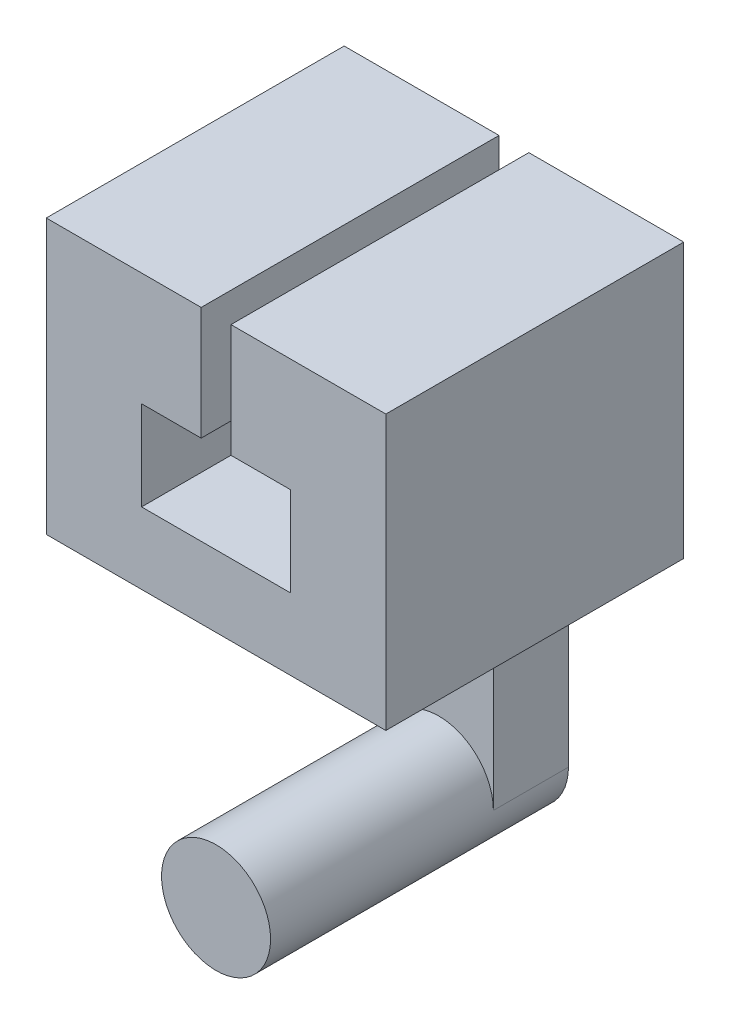
ISO-10303-21;
HEADER;
FILE_DESCRIPTION(('STEP AP214'),'2;1');
FILE_NAME('part.step','',(''),(''),'','','');
FILE_SCHEMA(('AUTOMOTIVE_DESIGN { 1 0 10303 214 1 1 1 1 }'));
ENDSEC;
DATA;
#1=APPLICATION_CONTEXT('core data for automotive mechanical design processes');
#2=APPLICATION_PROTOCOL_DEFINITION('international standard','automotive_design',2000,#1);
#3=PRODUCT_CONTEXT('',#1,'mechanical');
#4=PRODUCT('Part','Part','',(#3));
#5=PRODUCT_RELATED_PRODUCT_CATEGORY('part','',(#4));
#6=PRODUCT_DEFINITION_FORMATION('','',#4);
#7=PRODUCT_DEFINITION_CONTEXT('part definition',#1,'design');
#8=PRODUCT_DEFINITION('design','',#6,#7);
#9=PRODUCT_DEFINITION_SHAPE('','',#8);
#10=(LENGTH_UNIT() NAMED_UNIT(*) SI_UNIT(.MILLI.,.METRE.));
#11=(NAMED_UNIT(*) PLANE_ANGLE_UNIT() SI_UNIT($,.RADIAN.));
#12=(NAMED_UNIT(*) SI_UNIT($,.STERADIAN.) SOLID_ANGLE_UNIT());
#13=UNCERTAINTY_MEASURE_WITH_UNIT(LENGTH_MEASURE(1.E-05),#10,'distance_accuracy_value','');
#14=(GEOMETRIC_REPRESENTATION_CONTEXT(3) GLOBAL_UNCERTAINTY_ASSIGNED_CONTEXT((#13)) GLOBAL_UNIT_ASSIGNED_CONTEXT((#10,
#11,#12)) REPRESENTATION_CONTEXT('',''));
#15=CARTESIAN_POINT('',(0.,0.,0.));
#16=DIRECTION('',(0.,0.,1.));
#17=DIRECTION('',(1.,0.,0.));
#18=AXIS2_PLACEMENT_3D('',#15,#16,#17);
#19=CARTESIAN_POINT('',(31.75,132.08,-127.));
#20=DIRECTION('',(1.,0.,0.));
#21=DIRECTION('',(0.,0.,-1.));
#22=AXIS2_PLACEMENT_3D('',#19,#20,#21);
#23=PLANE('',#22);
#24=DIRECTION('',(0.,0.,1.));
#25=VECTOR('',#24,1.);
#26=CARTESIAN_POINT('',(31.75,170.18,-127.));
#27=LINE('',#26,#25);
#28=CARTESIAN_POINT('',(31.75,170.18,-127.));
#29=VERTEX_POINT('',#28);
#30=CARTESIAN_POINT('',(31.75,170.18,0.));
#31=VERTEX_POINT('',#30);
#32=EDGE_CURVE('E275',#29,#31,#27,.T.);
#33=ORIENTED_EDGE('',*,*,#32,.F.);
#34=DIRECTION('',(0.,1.,0.));
#35=VECTOR('',#34,1.);
#36=CARTESIAN_POINT('',(31.75,132.08,-127.));
#37=LINE('',#36,#35);
#38=CARTESIAN_POINT('',(31.75,132.08,-127.));
#39=VERTEX_POINT('',#38);
#40=EDGE_CURVE('E373',#39,#29,#37,.T.);
#41=ORIENTED_EDGE('',*,*,#40,.F.);
#42=DIRECTION('',(0.,0.,1.));
#43=VECTOR('',#42,1.);
#44=CARTESIAN_POINT('',(31.75,132.08,-127.));
#45=LINE('',#44,#43);
#46=CARTESIAN_POINT('',(31.75,132.08,0.));
#47=VERTEX_POINT('',#46);
#48=EDGE_CURVE('E278',#39,#47,#45,.T.);
#49=ORIENTED_EDGE('',*,*,#48,.T.);
#50=DIRECTION('',(0.,1.,0.));
#51=VECTOR('',#50,1.);
#52=CARTESIAN_POINT('',(31.75,132.08,0.));
#53=LINE('',#52,#51);
#54=EDGE_CURVE('E367',#47,#31,#53,.T.);
#55=ORIENTED_EDGE('',*,*,#54,.T.);
#56=EDGE_LOOP('',(#33,#41,#49,#55));
#57=FACE_BOUND('',#56,.T.);
#58=ADVANCED_FACE('F251',(#57),#23,.F.);
#59=CARTESIAN_POINT('',(31.75,132.08,0.));
#60=DIRECTION('',(0.,-1.,0.));
#61=DIRECTION('',(0.,0.,-1.));
#62=AXIS2_PLACEMENT_3D('',#59,#60,#61);
#63=PLANE('',#62);
#64=ORIENTED_EDGE('',*,*,#48,.F.);
#65=DIRECTION('',(-1.,0.,0.));
#66=VECTOR('',#65,1.);
#67=CARTESIAN_POINT('',(31.75,132.08,-127.));
#68=LINE('',#67,#66);
#69=CARTESIAN_POINT('',(-31.75,132.08,-127.));
#70=VERTEX_POINT('',#69);
#71=EDGE_CURVE('E492',#39,#70,#68,.T.);
#72=ORIENTED_EDGE('',*,*,#71,.T.);
#73=DIRECTION('',(0.,0.,1.));
#74=VECTOR('',#73,1.);
#75=CARTESIAN_POINT('',(-31.75,132.08,-127.));
#76=LINE('',#75,#74);
#77=CARTESIAN_POINT('',(-31.75,132.08,0.));
#78=VERTEX_POINT('',#77);
#79=EDGE_CURVE('E472',#70,#78,#76,.T.);
#80=ORIENTED_EDGE('',*,*,#79,.T.);
#81=DIRECTION('',(-1.,0.,0.));
#82=VECTOR('',#81,1.);
#83=CARTESIAN_POINT('',(31.75,132.08,0.));
#84=LINE('',#83,#82);
#85=EDGE_CURVE('E494',#47,#78,#84,.T.);
#86=ORIENTED_EDGE('',*,*,#85,.F.);
#87=EDGE_LOOP('',(#64,#72,#80,#86));
#88=FACE_BOUND('',#87,.T.);
#89=ADVANCED_FACE('F619',(#88),#63,.F.);
#90=CARTESIAN_POINT('',(-31.75,132.08,-127.));
#91=DIRECTION('',(1.,0.,0.));
#92=DIRECTION('',(0.,0.,-1.));
#93=AXIS2_PLACEMENT_3D('',#90,#91,#92);
#94=PLANE('',#93);
#95=DIRECTION('',(0.,1.,0.));
#96=VECTOR('',#95,1.);
#97=CARTESIAN_POINT('',(-31.75,132.08,-127.));
#98=LINE('',#97,#96);
#99=CARTESIAN_POINT('',(-31.75,170.18,-127.));
#100=VERTEX_POINT('',#99);
#101=EDGE_CURVE('E470',#70,#100,#98,.T.);
#102=ORIENTED_EDGE('',*,*,#101,.T.);
#103=DIRECTION('',(0.,0.,1.));
#104=VECTOR('',#103,1.);
#105=CARTESIAN_POINT('',(-31.75,170.18,-127.));
#106=LINE('',#105,#104);
#107=CARTESIAN_POINT('',(-31.75,170.18,0.));
#108=VERTEX_POINT('',#107);
#109=EDGE_CURVE('E440',#100,#108,#106,.T.);
#110=ORIENTED_EDGE('',*,*,#109,.T.);
#111=DIRECTION('',(0.,1.,0.));
#112=VECTOR('',#111,1.);
#113=CARTESIAN_POINT('',(-31.75,132.08,0.));
#114=LINE('',#113,#112);
#115=EDGE_CURVE('E467',#78,#108,#114,.T.);
#116=ORIENTED_EDGE('',*,*,#115,.F.);
#117=ORIENTED_EDGE('',*,*,#79,.F.);
#118=EDGE_LOOP('',(#102,#110,#116,#117));
#119=FACE_BOUND('',#118,.T.);
#120=ADVANCED_FACE('F622',(#119),#94,.T.);
#121=CARTESIAN_POINT('',(23.241,0.,-94.996));
#122=DIRECTION('',(1.,0.,0.));
#123=DIRECTION('',(0.,0.,-1.));
#124=AXIS2_PLACEMENT_3D('',#121,#122,#123);
#125=PLANE('',#124);
#126=DIRECTION('',(0.,-1.,0.));
#127=VECTOR('',#126,1.);
#128=CARTESIAN_POINT('',(23.241,0.,-127.));
#129=LINE('',#128,#127);
#130=CARTESIAN_POINT('',(23.241,101.6,-127.));
#131=VERTEX_POINT('',#130);
#132=CARTESIAN_POINT('',(23.241,0.,-127.));
#133=VERTEX_POINT('',#132);
#134=EDGE_CURVE('E498',#131,#133,#129,.T.);
#135=ORIENTED_EDGE('',*,*,#134,.F.);
#136=DIRECTION('',(0.,0.,-1.));
#137=VECTOR('',#136,1.);
#138=CARTESIAN_POINT('',(23.241,101.6,-94.996));
#139=LINE('',#138,#137);
#140=CARTESIAN_POINT('',(23.241,101.6,-94.996));
#141=VERTEX_POINT('',#140);
#142=EDGE_CURVE('E13',#141,#131,#139,.T.);
#143=ORIENTED_EDGE('',*,*,#142,.F.);
#144=DIRECTION('',(0.,-1.,0.));
#145=VECTOR('',#144,1.);
#146=CARTESIAN_POINT('',(23.241,0.,-94.996));
#147=LINE('',#146,#145);
#148=CARTESIAN_POINT('',(23.241,0.,-94.996));
#149=VERTEX_POINT('',#148);
#150=EDGE_CURVE('E504',#141,#149,#147,.T.);
#151=ORIENTED_EDGE('',*,*,#150,.T.);
#152=DIRECTION('',(0.,0.,-1.));
#153=VECTOR('',#152,1.);
#154=CARTESIAN_POINT('',(23.241,0.,-94.996));
#155=LINE('',#154,#153);
#156=EDGE_CURVE('E259',#149,#133,#155,.T.);
#157=ORIENTED_EDGE('',*,*,#156,.T.);
#158=EDGE_LOOP('',(#135,#143,#151,#157));
#159=FACE_BOUND('',#158,.T.);
#160=ADVANCED_FACE('F257',(#159),#125,.T.);
#161=CARTESIAN_POINT('',(-23.241,0.,-94.996));
#162=DIRECTION('',(-1.,0.,0.));
#163=DIRECTION('',(0.,0.,1.));
#164=AXIS2_PLACEMENT_3D('',#161,#162,#163);
#165=PLANE('',#164);
#166=DIRECTION('',(0.,1.,0.));
#167=VECTOR('',#166,1.);
#168=CARTESIAN_POINT('',(-23.241,0.,-127.));
#169=LINE('',#168,#167);
#170=CARTESIAN_POINT('',(-23.241,0.,-127.));
#171=VERTEX_POINT('',#170);
#172=CARTESIAN_POINT('',(-23.241,101.6,-127.));
#173=VERTEX_POINT('',#172);
#174=EDGE_CURVE('E509',#171,#173,#169,.T.);
#175=ORIENTED_EDGE('',*,*,#174,.F.);
#176=DIRECTION('',(0.,0.,-1.));
#177=VECTOR('',#176,1.);
#178=CARTESIAN_POINT('',(-23.241,0.,-94.996));
#179=LINE('',#178,#177);
#180=CARTESIAN_POINT('',(-23.241,0.,-94.996));
#181=VERTEX_POINT('',#180);
#182=EDGE_CURVE('E535',#181,#171,#179,.T.);
#183=ORIENTED_EDGE('',*,*,#182,.F.);
#184=DIRECTION('',(0.,1.,0.));
#185=VECTOR('',#184,1.);
#186=CARTESIAN_POINT('',(-23.241,0.,-94.996));
#187=LINE('',#186,#185);
#188=CARTESIAN_POINT('',(-23.241,101.6,-94.996));
#189=VERTEX_POINT('',#188);
#190=EDGE_CURVE('E511',#181,#189,#187,.T.);
#191=ORIENTED_EDGE('',*,*,#190,.T.);
#192=DIRECTION('',(0.,0.,-1.));
#193=VECTOR('',#192,1.);
#194=CARTESIAN_POINT('',(-23.241,101.6,-94.996));
#195=LINE('',#194,#193);
#196=EDGE_CURVE('E262',#189,#173,#195,.T.);
#197=ORIENTED_EDGE('',*,*,#196,.T.);
#198=EDGE_LOOP('',(#175,#183,#191,#197));
#199=FACE_BOUND('',#198,.T.);
#200=ADVANCED_FACE('F606',(#199),#165,.T.);
#201=CARTESIAN_POINT('',(23.241,0.,-94.996));
#202=DIRECTION('',(0.,-1.,0.));
#203=DIRECTION('',(0.,0.,-1.));
#204=AXIS2_PLACEMENT_3D('',#201,#202,#203);
#205=PLANE('',#204);
#206=DIRECTION('',(-1.,0.,0.));
#207=VECTOR('',#206,1.);
#208=CARTESIAN_POINT('',(23.241,0.,-127.));
#209=LINE('',#208,#207);
#210=EDGE_CURVE('E522',#133,#171,#209,.T.);
#211=ORIENTED_EDGE('',*,*,#210,.F.);
#212=ORIENTED_EDGE('',*,*,#156,.F.);
#213=DIRECTION('',(-1.,0.,0.));
#214=VECTOR('',#213,1.);
#215=CARTESIAN_POINT('',(23.241,0.,-94.996));
#216=LINE('',#215,#214);
#217=EDGE_CURVE('E508',#149,#181,#216,.T.);
#218=ORIENTED_EDGE('',*,*,#217,.T.);
#219=ORIENTED_EDGE('',*,*,#182,.T.);
#220=EDGE_LOOP('',(#211,#212,#218,#219));
#221=FACE_BOUND('',#220,.T.);
#222=ADVANCED_FACE('F543',(#221),#205,.T.);
#223=CARTESIAN_POINT('',(0.,0.,-94.996));
#224=DIRECTION('',(0.,0.,1.));
#225=DIRECTION('',(1.,0.,0.));
#226=AXIS2_PLACEMENT_3D('',#223,#224,#225);
#227=PLANE('',#226);
#228=ORIENTED_EDGE('',*,*,#150,.F.);
#229=DIRECTION('',(1.,0.,0.));
#230=VECTOR('',#229,1.);
#231=CARTESIAN_POINT('',(23.241,101.6,-94.996));
#232=LINE('',#231,#230);
#233=EDGE_CURVE('E520',#189,#141,#232,.T.);
#234=ORIENTED_EDGE('',*,*,#233,.F.);
#235=ORIENTED_EDGE('',*,*,#190,.F.);
#236=ORIENTED_EDGE('',*,*,#217,.F.);
#237=EDGE_LOOP('',(#228,#234,#235,#236));
#238=FACE_BOUND('',#237,.T.);
#239=ADVANCED_FACE('F607',(#238),#227,.T.);
#240=CARTESIAN_POINT('',(0.,0.,-127.));
#241=DIRECTION('',(0.,0.,1.));
#242=DIRECTION('',(1.,0.,0.));
#243=AXIS2_PLACEMENT_3D('',#240,#241,#242);
#244=PLANE('',#243);
#245=ORIENTED_EDGE('',*,*,#134,.T.);
#246=ORIENTED_EDGE('',*,*,#210,.T.);
#247=ORIENTED_EDGE('',*,*,#174,.T.);
#248=DIRECTION('',(1.,0.,0.));
#249=VECTOR('',#248,1.);
#250=CARTESIAN_POINT('',(23.241,101.6,-127.));
#251=LINE('',#250,#249);
#252=CARTESIAN_POINT('',(-72.39,101.6,-127.));
#253=VERTEX_POINT('',#252);
#254=EDGE_CURVE('E497',#253,#173,#251,.T.);
#255=ORIENTED_EDGE('',*,*,#254,.F.);
#256=DIRECTION('',(0.,-1.,0.));
#257=VECTOR('',#256,1.);
#258=CARTESIAN_POINT('',(-72.39,132.08,-127.));
#259=LINE('',#258,#257);
#260=CARTESIAN_POINT('',(-72.39,218.44,-127.));
#261=VERTEX_POINT('',#260);
#262=EDGE_CURVE('E484',#261,#253,#259,.T.);
#263=ORIENTED_EDGE('',*,*,#262,.F.);
#264=DIRECTION('',(-1.,0.,0.));
#265=VECTOR('',#264,1.);
#266=CARTESIAN_POINT('',(-31.75,218.44,-127.));
#267=LINE('',#266,#265);
#268=CARTESIAN_POINT('',(-6.35,218.44,-127.));
#269=VERTEX_POINT('',#268);
#270=EDGE_CURVE('E453',#269,#261,#267,.T.);
#271=ORIENTED_EDGE('',*,*,#270,.F.);
#272=DIRECTION('',(0.,1.,0.));
#273=VECTOR('',#272,1.);
#274=CARTESIAN_POINT('',(-6.35,170.18,-127.));
#275=LINE('',#274,#273);
#276=CARTESIAN_POINT('',(-6.35,170.18,-127.));
#277=VERTEX_POINT('',#276);
#278=EDGE_CURVE('E435',#277,#269,#275,.T.);
#279=ORIENTED_EDGE('',*,*,#278,.F.);
#280=DIRECTION('',(1.,0.,0.));
#281=VECTOR('',#280,1.);
#282=CARTESIAN_POINT('',(-31.75,170.18,-127.));
#283=LINE('',#282,#281);
#284=EDGE_CURVE('E426',#100,#277,#283,.T.);
#285=ORIENTED_EDGE('',*,*,#284,.F.);
#286=ORIENTED_EDGE('',*,*,#101,.F.);
#287=ORIENTED_EDGE('',*,*,#71,.F.);
#288=ORIENTED_EDGE('',*,*,#40,.T.);
#289=DIRECTION('',(1.,0.,0.));
#290=VECTOR('',#289,1.);
#291=CARTESIAN_POINT('',(31.75,170.18,-127.));
#292=LINE('',#291,#290);
#293=CARTESIAN_POINT('',(6.35,170.18,-127.));
#294=VERTEX_POINT('',#293);
#295=EDGE_CURVE('E385',#294,#29,#292,.T.);
#296=ORIENTED_EDGE('',*,*,#295,.F.);
#297=DIRECTION('',(0.,-1.,0.));
#298=VECTOR('',#297,1.);
#299=CARTESIAN_POINT('',(6.35,170.18,-127.));
#300=LINE('',#299,#298);
#301=CARTESIAN_POINT('',(6.35,218.44,-127.));
#302=VERTEX_POINT('',#301);
#303=EDGE_CURVE('E391',#302,#294,#300,.T.);
#304=ORIENTED_EDGE('',*,*,#303,.F.);
#305=DIRECTION('',(-1.,0.,0.));
#306=VECTOR('',#305,1.);
#307=CARTESIAN_POINT('',(31.75,218.44,-127.));
#308=LINE('',#307,#306);
#309=CARTESIAN_POINT('',(72.39,218.44,-127.));
#310=VERTEX_POINT('',#309);
#311=EDGE_CURVE('E409',#310,#302,#308,.T.);
#312=ORIENTED_EDGE('',*,*,#311,.F.);
#313=DIRECTION('',(0.,1.,0.));
#314=VECTOR('',#313,1.);
#315=CARTESIAN_POINT('',(72.39,101.6,-127.));
#316=LINE('',#315,#314);
#317=CARTESIAN_POINT('',(72.39,101.6,-127.));
#318=VERTEX_POINT('',#317);
#319=EDGE_CURVE('E423',#318,#310,#316,.T.);
#320=ORIENTED_EDGE('',*,*,#319,.F.);
#321=EDGE_CURVE('E487',#131,#318,#251,.T.);
#322=ORIENTED_EDGE('',*,*,#321,.F.);
#323=EDGE_LOOP('',(#245,#246,#247,#255,#263,#271,#279,#285,#286,#287,#288,#296,#304,#312,#320,#322));
#324=FACE_BOUND('',#323,.T.);
#325=ADVANCED_FACE('F547',(#324),#244,.F.);
#326=CARTESIAN_POINT('',(23.241,101.6,0.));
#327=DIRECTION('',(0.,1.,0.));
#328=DIRECTION('',(0.,0.,1.));
#329=AXIS2_PLACEMENT_3D('',#326,#327,#328);
#330=PLANE('',#329);
#331=ORIENTED_EDGE('',*,*,#196,.F.);
#332=ORIENTED_EDGE('',*,*,#233,.T.);
#333=ORIENTED_EDGE('',*,*,#142,.T.);
#334=ORIENTED_EDGE('',*,*,#321,.T.);
#335=DIRECTION('',(0.,0.,1.));
#336=VECTOR('',#335,1.);
#337=CARTESIAN_POINT('',(72.39,101.6,-127.));
#338=LINE('',#337,#336);
#339=CARTESIAN_POINT('',(72.39,101.6,0.));
#340=VERTEX_POINT('',#339);
#341=EDGE_CURVE('E419',#318,#340,#338,.T.);
#342=ORIENTED_EDGE('',*,*,#341,.T.);
#343=DIRECTION('',(1.,0.,0.));
#344=VECTOR('',#343,1.);
#345=CARTESIAN_POINT('',(-31.75,101.6,0.));
#346=LINE('',#345,#344);
#347=CARTESIAN_POINT('',(-72.39,101.6,0.));
#348=VERTEX_POINT('',#347);
#349=EDGE_CURVE('E493',#348,#340,#346,.T.);
#350=ORIENTED_EDGE('',*,*,#349,.F.);
#351=DIRECTION('',(0.,0.,1.));
#352=VECTOR('',#351,1.);
#353=CARTESIAN_POINT('',(-72.39,101.6,-127.));
#354=LINE('',#353,#352);
#355=EDGE_CURVE('E478',#253,#348,#354,.T.);
#356=ORIENTED_EDGE('',*,*,#355,.F.);
#357=ORIENTED_EDGE('',*,*,#254,.T.);
#358=EDGE_LOOP('',(#331,#332,#333,#334,#342,#350,#356,#357));
#359=FACE_BOUND('',#358,.T.);
#360=ADVANCED_FACE('F592',(#359),#330,.F.);
#361=CARTESIAN_POINT('',(0.,0.,0.));
#362=DIRECTION('',(0.,0.,1.));
#363=DIRECTION('',(1.,0.,0.));
#364=AXIS2_PLACEMENT_3D('',#361,#362,#363);
#365=PLANE('',#364);
#366=ORIENTED_EDGE('',*,*,#349,.T.);
#367=DIRECTION('',(0.,1.,0.));
#368=VECTOR('',#367,1.);
#369=CARTESIAN_POINT('',(72.39,101.6,0.));
#370=LINE('',#369,#368);
#371=CARTESIAN_POINT('',(72.39,218.44,0.));
#372=VERTEX_POINT('',#371);
#373=EDGE_CURVE('E422',#340,#372,#370,.T.);
#374=ORIENTED_EDGE('',*,*,#373,.T.);
#375=DIRECTION('',(-1.,0.,0.));
#376=VECTOR('',#375,1.);
#377=CARTESIAN_POINT('',(31.75,218.44,0.));
#378=LINE('',#377,#376);
#379=CARTESIAN_POINT('',(6.35,218.44,0.));
#380=VERTEX_POINT('',#379);
#381=EDGE_CURVE('E372',#372,#380,#378,.T.);
#382=ORIENTED_EDGE('',*,*,#381,.T.);
#383=DIRECTION('',(0.,-1.,0.));
#384=VECTOR('',#383,1.);
#385=CARTESIAN_POINT('',(6.35,170.18,0.));
#386=LINE('',#385,#384);
#387=CARTESIAN_POINT('',(6.35,170.18,0.));
#388=VERTEX_POINT('',#387);
#389=EDGE_CURVE('E386',#380,#388,#386,.T.);
#390=ORIENTED_EDGE('',*,*,#389,.T.);
#391=DIRECTION('',(1.,0.,0.));
#392=VECTOR('',#391,1.);
#393=CARTESIAN_POINT('',(31.75,170.18,0.));
#394=LINE('',#393,#392);
#395=EDGE_CURVE('E379',#388,#31,#394,.T.);
#396=ORIENTED_EDGE('',*,*,#395,.T.);
#397=ORIENTED_EDGE('',*,*,#54,.F.);
#398=ORIENTED_EDGE('',*,*,#85,.T.);
#399=ORIENTED_EDGE('',*,*,#115,.T.);
#400=DIRECTION('',(1.,0.,0.));
#401=VECTOR('',#400,1.);
#402=CARTESIAN_POINT('',(-31.75,170.18,0.));
#403=LINE('',#402,#401);
#404=CARTESIAN_POINT('',(-6.35,170.18,0.));
#405=VERTEX_POINT('',#404);
#406=EDGE_CURVE('E424',#108,#405,#403,.T.);
#407=ORIENTED_EDGE('',*,*,#406,.T.);
#408=DIRECTION('',(0.,1.,0.));
#409=VECTOR('',#408,1.);
#410=CARTESIAN_POINT('',(-6.35,170.18,0.));
#411=LINE('',#410,#409);
#412=CARTESIAN_POINT('',(-6.35,218.44,0.));
#413=VERTEX_POINT('',#412);
#414=EDGE_CURVE('E433',#405,#413,#411,.T.);
#415=ORIENTED_EDGE('',*,*,#414,.T.);
#416=DIRECTION('',(-1.,0.,0.));
#417=VECTOR('',#416,1.);
#418=CARTESIAN_POINT('',(-31.75,218.44,0.));
#419=LINE('',#418,#417);
#420=CARTESIAN_POINT('',(-72.39,218.44,0.));
#421=VERTEX_POINT('',#420);
#422=EDGE_CURVE('E449',#413,#421,#419,.T.);
#423=ORIENTED_EDGE('',*,*,#422,.T.);
#424=DIRECTION('',(0.,-1.,0.));
#425=VECTOR('',#424,1.);
#426=CARTESIAN_POINT('',(-72.39,132.08,0.));
#427=LINE('',#426,#425);
#428=EDGE_CURVE('E485',#421,#348,#427,.T.);
#429=ORIENTED_EDGE('',*,*,#428,.T.);
#430=EDGE_LOOP('',(#366,#374,#382,#390,#396,#397,#398,#399,#407,#415,#423,#429));
#431=FACE_BOUND('',#430,.T.);
#432=ADVANCED_FACE('F390',(#431),#365,.T.);
#433=CARTESIAN_POINT('',(-72.39,132.08,-127.));
#434=DIRECTION('',(-1.,0.,0.));
#435=DIRECTION('',(0.,0.,1.));
#436=AXIS2_PLACEMENT_3D('',#433,#434,#435);
#437=PLANE('',#436);
#438=ORIENTED_EDGE('',*,*,#428,.F.);
#439=DIRECTION('',(0.,0.,1.));
#440=VECTOR('',#439,1.);
#441=CARTESIAN_POINT('',(-72.39,218.44,-127.));
#442=LINE('',#441,#440);
#443=EDGE_CURVE('E457',#261,#421,#442,.T.);
#444=ORIENTED_EDGE('',*,*,#443,.F.);
#445=ORIENTED_EDGE('',*,*,#262,.T.);
#446=ORIENTED_EDGE('',*,*,#355,.T.);
#447=EDGE_LOOP('',(#438,#444,#445,#446));
#448=FACE_BOUND('',#447,.T.);
#449=ADVANCED_FACE('F598',(#448),#437,.T.);
#450=CARTESIAN_POINT('',(-31.75,218.44,-127.));
#451=DIRECTION('',(0.,1.,0.));
#452=DIRECTION('',(0.,0.,1.));
#453=AXIS2_PLACEMENT_3D('',#450,#451,#452);
#454=PLANE('',#453);
#455=ORIENTED_EDGE('',*,*,#422,.F.);
#456=DIRECTION('',(0.,0.,1.));
#457=VECTOR('',#456,1.);
#458=CARTESIAN_POINT('',(-6.35,218.44,-127.));
#459=LINE('',#458,#457);
#460=EDGE_CURVE('E443',#269,#413,#459,.T.);
#461=ORIENTED_EDGE('',*,*,#460,.F.);
#462=ORIENTED_EDGE('',*,*,#270,.T.);
#463=ORIENTED_EDGE('',*,*,#443,.T.);
#464=EDGE_LOOP('',(#455,#461,#462,#463));
#465=FACE_BOUND('',#464,.T.);
#466=ADVANCED_FACE('F640',(#465),#454,.T.);
#467=CARTESIAN_POINT('',(-6.35,170.18,-127.));
#468=DIRECTION('',(1.,0.,0.));
#469=DIRECTION('',(0.,0.,-1.));
#470=AXIS2_PLACEMENT_3D('',#467,#468,#469);
#471=PLANE('',#470);
#472=ORIENTED_EDGE('',*,*,#414,.F.);
#473=DIRECTION('',(0.,0.,1.));
#474=VECTOR('',#473,1.);
#475=CARTESIAN_POINT('',(-6.35,170.18,-127.));
#476=LINE('',#475,#474);
#477=EDGE_CURVE('E446',#277,#405,#476,.T.);
#478=ORIENTED_EDGE('',*,*,#477,.F.);
#479=ORIENTED_EDGE('',*,*,#278,.T.);
#480=ORIENTED_EDGE('',*,*,#460,.T.);
#481=EDGE_LOOP('',(#472,#478,#479,#480));
#482=FACE_BOUND('',#481,.T.);
#483=ADVANCED_FACE('F632',(#482),#471,.T.);
#484=CARTESIAN_POINT('',(-31.75,170.18,-127.));
#485=DIRECTION('',(0.,-1.,0.));
#486=DIRECTION('',(0.,0.,-1.));
#487=AXIS2_PLACEMENT_3D('',#484,#485,#486);
#488=PLANE('',#487);
#489=ORIENTED_EDGE('',*,*,#406,.F.);
#490=ORIENTED_EDGE('',*,*,#109,.F.);
#491=ORIENTED_EDGE('',*,*,#284,.T.);
#492=ORIENTED_EDGE('',*,*,#477,.T.);
#493=EDGE_LOOP('',(#489,#490,#491,#492));
#494=FACE_BOUND('',#493,.T.);
#495=ADVANCED_FACE('F633',(#494),#488,.T.);
#496=CARTESIAN_POINT('',(72.39,101.6,-127.));
#497=DIRECTION('',(1.,0.,0.));
#498=DIRECTION('',(0.,0.,-1.));
#499=AXIS2_PLACEMENT_3D('',#496,#497,#498);
#500=PLANE('',#499);
#501=ORIENTED_EDGE('',*,*,#373,.F.);
#502=ORIENTED_EDGE('',*,*,#341,.F.);
#503=ORIENTED_EDGE('',*,*,#319,.T.);
#504=DIRECTION('',(0.,0.,1.));
#505=VECTOR('',#504,1.);
#506=CARTESIAN_POINT('',(72.39,218.44,-127.));
#507=LINE('',#506,#505);
#508=EDGE_CURVE('E397',#310,#372,#507,.T.);
#509=ORIENTED_EDGE('',*,*,#508,.T.);
#510=EDGE_LOOP('',(#501,#502,#503,#509));
#511=FACE_BOUND('',#510,.T.);
#512=ADVANCED_FACE('F591',(#511),#500,.T.);
#513=CARTESIAN_POINT('',(31.75,218.44,-127.));
#514=DIRECTION('',(0.,1.,0.));
#515=DIRECTION('',(0.,0.,1.));
#516=AXIS2_PLACEMENT_3D('',#513,#514,#515);
#517=PLANE('',#516);
#518=ORIENTED_EDGE('',*,*,#381,.F.);
#519=ORIENTED_EDGE('',*,*,#508,.F.);
#520=ORIENTED_EDGE('',*,*,#311,.T.);
#521=DIRECTION('',(0.,0.,1.));
#522=VECTOR('',#521,1.);
#523=CARTESIAN_POINT('',(6.35,218.44,-127.));
#524=LINE('',#523,#522);
#525=EDGE_CURVE('E401',#302,#380,#524,.T.);
#526=ORIENTED_EDGE('',*,*,#525,.T.);
#527=EDGE_LOOP('',(#518,#519,#520,#526));
#528=FACE_BOUND('',#527,.T.);
#529=ADVANCED_FACE('F627',(#528),#517,.T.);
#530=CARTESIAN_POINT('',(31.75,170.18,-127.));
#531=DIRECTION('',(0.,-1.,0.));
#532=DIRECTION('',(1.,0.,0.));
#533=AXIS2_PLACEMENT_3D('',#530,#531,#532);
#534=PLANE('',#533);
#535=ORIENTED_EDGE('',*,*,#395,.F.);
#536=DIRECTION('',(0.,0.,1.));
#537=VECTOR('',#536,1.);
#538=CARTESIAN_POINT('',(6.35,170.18,-127.));
#539=LINE('',#538,#537);
#540=EDGE_CURVE('E381',#294,#388,#539,.T.);
#541=ORIENTED_EDGE('',*,*,#540,.F.);
#542=ORIENTED_EDGE('',*,*,#295,.T.);
#543=ORIENTED_EDGE('',*,*,#32,.T.);
#544=EDGE_LOOP('',(#535,#541,#542,#543));
#545=FACE_BOUND('',#544,.T.);
#546=ADVANCED_FACE('F378',(#545),#534,.T.);
#547=CARTESIAN_POINT('',(6.35,170.18,-127.));
#548=DIRECTION('',(-1.,0.,0.));
#549=DIRECTION('',(0.,0.,1.));
#550=AXIS2_PLACEMENT_3D('',#547,#548,#549);
#551=PLANE('',#550);
#552=ORIENTED_EDGE('',*,*,#389,.F.);
#553=ORIENTED_EDGE('',*,*,#525,.F.);
#554=ORIENTED_EDGE('',*,*,#303,.T.);
#555=ORIENTED_EDGE('',*,*,#540,.T.);
#556=EDGE_LOOP('',(#552,#553,#554,#555));
#557=FACE_BOUND('',#556,.T.);
#558=ADVANCED_FACE('F701',(#557),#551,.T.);
#559=CLOSED_SHELL('',(#58,#89,#120,#160,#200,#222,#239,#325,#360,#432,#449,#466,#483,#495,#512,
#529,#546,#558));
#560=MANIFOLD_SOLID_BREP('B2',#559);
#561=CARTESIAN_POINT('',(0.,0.,-127.));
#562=DIRECTION('',(0.,0.,1.));
#563=DIRECTION('',(1.,0.,0.));
#564=AXIS2_PLACEMENT_3D('',#561,#562,#563);
#565=CYLINDRICAL_SURFACE('',#564,23.241);
#566=CARTESIAN_POINT('',(0.,0.,-127.));
#567=DIRECTION('',(0.,0.,1.));
#568=DIRECTION('',(1.,0.,0.));
#569=AXIS2_PLACEMENT_3D('',#566,#567,#568);
#570=CIRCLE('',#569,23.241);
#571=CARTESIAN_POINT('',(23.241,0.,-127.));
#572=VERTEX_POINT('',#571);
#573=EDGE_CURVE('E254',#572,#572,#570,.T.);
#574=ORIENTED_EDGE('',*,*,#573,.T.);
#575=EDGE_LOOP('',(#574));
#576=FACE_BOUND('',#575,.T.);
#577=CARTESIAN_POINT('',(0.,0.,0.));
#578=DIRECTION('',(0.,0.,1.));
#579=DIRECTION('',(1.,0.,0.));
#580=AXIS2_PLACEMENT_3D('',#577,#578,#579);
#581=CIRCLE('',#580,23.241);
#582=CARTESIAN_POINT('',(23.241,0.,0.));
#583=VERTEX_POINT('',#582);
#584=EDGE_CURVE('E883',#583,#583,#581,.T.);
#585=ORIENTED_EDGE('',*,*,#584,.F.);
#586=EDGE_LOOP('',(#585));
#587=FACE_BOUND('',#586,.T.);
#588=ADVANCED_FACE('F876',(#576,#587),#565,.T.);
#589=CARTESIAN_POINT('',(0.,0.,-127.));
#590=DIRECTION('',(0.,0.,1.));
#591=DIRECTION('',(1.,0.,0.));
#592=AXIS2_PLACEMENT_3D('',#589,#590,#591);
#593=PLANE('',#592);
#594=ORIENTED_EDGE('',*,*,#573,.F.);
#595=EDGE_LOOP('',(#594));
#596=FACE_BOUND('',#595,.T.);
#597=ADVANCED_FACE('F900',(#596),#593,.F.);
#598=CARTESIAN_POINT('',(0.,0.,0.));
#599=DIRECTION('',(0.,0.,1.));
#600=DIRECTION('',(1.,0.,0.));
#601=AXIS2_PLACEMENT_3D('',#598,#599,#600);
#602=PLANE('',#601);
#603=ORIENTED_EDGE('',*,*,#584,.T.);
#604=EDGE_LOOP('',(#603));
#605=FACE_BOUND('',#604,.T.);
#606=ADVANCED_FACE('F892',(#605),#602,.T.);
#607=CLOSED_SHELL('',(#588,#597,#606));
#608=MANIFOLD_SOLID_BREP('B7',#607);
#609=ADVANCED_BREP_SHAPE_REPRESENTATION('',(#18,#560,#608),#14);
#610=SHAPE_DEFINITION_REPRESENTATION(#9,#609);
ENDSEC;
END-ISO-10303-21;
